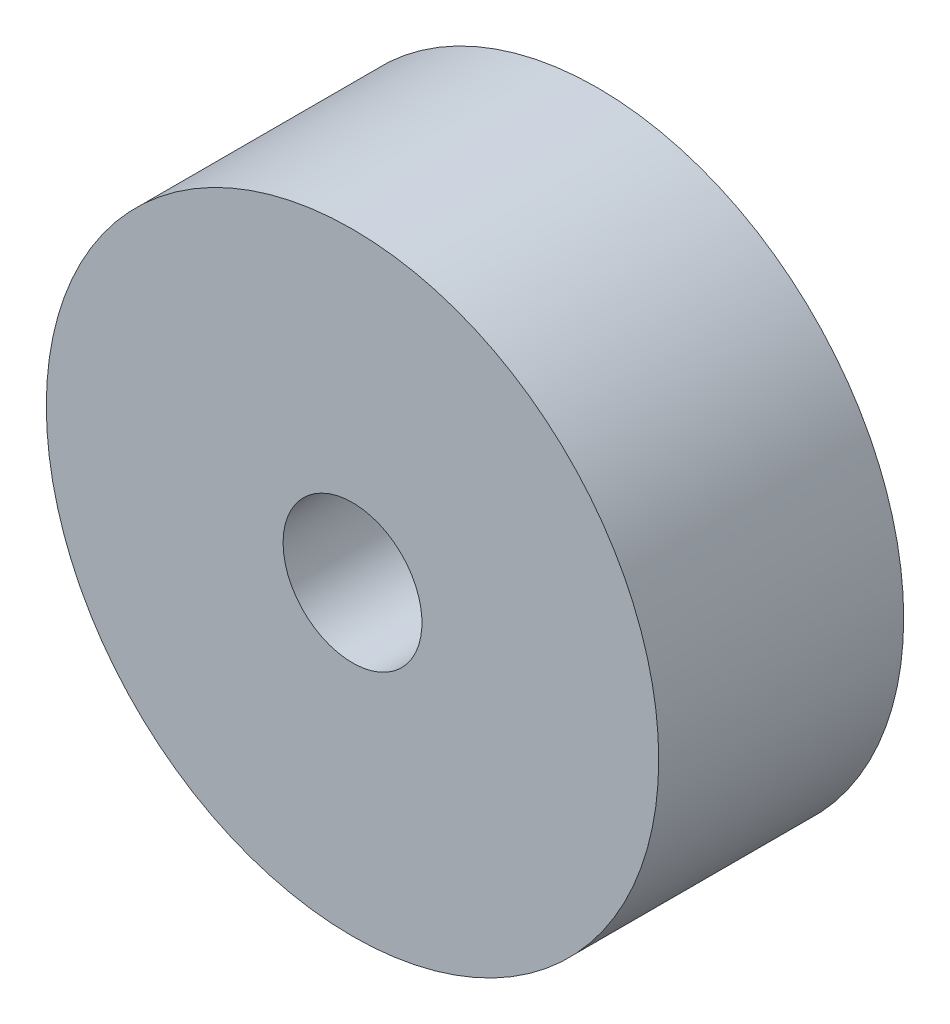
ISO-10303-21;
HEADER;
FILE_DESCRIPTION(('STEP AP214'),'2;1');
FILE_NAME('part.step','',(''),(''),'','','');
FILE_SCHEMA(('AUTOMOTIVE_DESIGN { 1 0 10303 214 1 1 1 1 }'));
ENDSEC;
DATA;
#1=APPLICATION_CONTEXT('core data for automotive mechanical design processes');
#2=APPLICATION_PROTOCOL_DEFINITION('international standard','automotive_design',2000,#1);
#3=PRODUCT_CONTEXT('',#1,'mechanical');
#4=PRODUCT('Part','Part','',(#3));
#5=PRODUCT_RELATED_PRODUCT_CATEGORY('part','',(#4));
#6=PRODUCT_DEFINITION_FORMATION('','',#4);
#7=PRODUCT_DEFINITION_CONTEXT('part definition',#1,'design');
#8=PRODUCT_DEFINITION('design','',#6,#7);
#9=PRODUCT_DEFINITION_SHAPE('','',#8);
#10=(LENGTH_UNIT() NAMED_UNIT(*) SI_UNIT(.MILLI.,.METRE.));
#11=(NAMED_UNIT(*) PLANE_ANGLE_UNIT() SI_UNIT($,.RADIAN.));
#12=(NAMED_UNIT(*) SI_UNIT($,.STERADIAN.) SOLID_ANGLE_UNIT());
#13=UNCERTAINTY_MEASURE_WITH_UNIT(LENGTH_MEASURE(1.E-05),#10,'distance_accuracy_value','');
#14=(GEOMETRIC_REPRESENTATION_CONTEXT(3) GLOBAL_UNCERTAINTY_ASSIGNED_CONTEXT((#13)) GLOBAL_UNIT_ASSIGNED_CONTEXT((#10,
#11,#12)) REPRESENTATION_CONTEXT('',''));
#15=CARTESIAN_POINT('',(0.,0.,0.));
#16=DIRECTION('',(0.,0.,1.));
#17=DIRECTION('',(1.,0.,0.));
#18=AXIS2_PLACEMENT_3D('',#15,#16,#17);
#19=CARTESIAN_POINT('',(3.5,0.,2.8));
#20=DIRECTION('',(0.,0.,1.));
#21=DIRECTION('',(1.,0.,0.));
#22=AXIS2_PLACEMENT_3D('',#19,#20,#21);
#23=PLANE('',#22);
#24=CARTESIAN_POINT('',(0.,0.,2.8));
#25=DIRECTION('',(0.,0.,-1.));
#26=DIRECTION('',(-1.,0.,0.));
#27=AXIS2_PLACEMENT_3D('',#24,#25,#26);
#28=CIRCLE('',#27,0.79375);
#29=CARTESIAN_POINT('',(-0.79375,0.,2.8));
#30=VERTEX_POINT('',#29);
#31=EDGE_CURVE('E10',#30,#30,#28,.T.);
#32=ORIENTED_EDGE('',*,*,#31,.T.);
#33=EDGE_LOOP('',(#32));
#34=FACE_BOUND('',#33,.T.);
#35=CARTESIAN_POINT('',(0.,0.,2.8));
#36=DIRECTION('',(0.,0.,-1.));
#37=DIRECTION('',(-1.,0.,0.));
#38=AXIS2_PLACEMENT_3D('',#35,#36,#37);
#39=CIRCLE('',#38,3.5);
#40=CARTESIAN_POINT('',(-3.5,0.,2.8));
#41=VERTEX_POINT('',#40);
#42=EDGE_CURVE('E45',#41,#41,#39,.T.);
#43=ORIENTED_EDGE('',*,*,#42,.F.);
#44=EDGE_LOOP('',(#43));
#45=FACE_BOUND('',#44,.T.);
#46=ADVANCED_FACE('F31',(#34,#45),#23,.T.);
#47=CARTESIAN_POINT('',(0.,0.,2.8));
#48=DIRECTION('',(0.,0.,-1.));
#49=DIRECTION('',(-1.,0.,0.));
#50=AXIS2_PLACEMENT_3D('',#47,#48,#49);
#51=CYLINDRICAL_SURFACE('',#50,0.79375);
#52=CARTESIAN_POINT('',(0.,0.,0.));
#53=DIRECTION('',(0.,0.,-1.));
#54=DIRECTION('',(-1.,0.,0.));
#55=AXIS2_PLACEMENT_3D('',#52,#53,#54);
#56=CIRCLE('',#55,0.79375);
#57=CARTESIAN_POINT('',(-0.79375,0.,0.));
#58=VERTEX_POINT('',#57);
#59=EDGE_CURVE('E37',#58,#58,#56,.T.);
#60=ORIENTED_EDGE('',*,*,#59,.T.);
#61=EDGE_LOOP('',(#60));
#62=FACE_BOUND('',#61,.T.);
#63=ORIENTED_EDGE('',*,*,#31,.F.);
#64=EDGE_LOOP('',(#63));
#65=FACE_BOUND('',#64,.T.);
#66=ADVANCED_FACE('F55',(#62,#65),#51,.F.);
#67=CARTESIAN_POINT('',(0.79375,0.,0.));
#68=DIRECTION('',(0.,0.,-1.));
#69=DIRECTION('',(-1.,0.,0.));
#70=AXIS2_PLACEMENT_3D('',#67,#68,#69);
#71=PLANE('',#70);
#72=CARTESIAN_POINT('',(0.,0.,0.));
#73=DIRECTION('',(0.,0.,-1.));
#74=DIRECTION('',(-1.,0.,0.));
#75=AXIS2_PLACEMENT_3D('',#72,#73,#74);
#76=CIRCLE('',#75,3.5);
#77=CARTESIAN_POINT('',(-3.5,0.,0.));
#78=VERTEX_POINT('',#77);
#79=EDGE_CURVE('E41',#78,#78,#76,.T.);
#80=ORIENTED_EDGE('',*,*,#79,.T.);
#81=EDGE_LOOP('',(#80));
#82=FACE_BOUND('',#81,.T.);
#83=ORIENTED_EDGE('',*,*,#59,.F.);
#84=EDGE_LOOP('',(#83));
#85=FACE_BOUND('',#84,.T.);
#86=ADVANCED_FACE('F59',(#82,#85),#71,.T.);
#87=CARTESIAN_POINT('',(0.,0.,2.8));
#88=DIRECTION('',(0.,0.,-1.));
#89=DIRECTION('',(-1.,0.,0.));
#90=AXIS2_PLACEMENT_3D('',#87,#88,#89);
#91=CYLINDRICAL_SURFACE('',#90,3.5);
#92=ORIENTED_EDGE('',*,*,#42,.T.);
#93=EDGE_LOOP('',(#92));
#94=FACE_BOUND('',#93,.T.);
#95=ORIENTED_EDGE('',*,*,#79,.F.);
#96=EDGE_LOOP('',(#95));
#97=FACE_BOUND('',#96,.T.);
#98=ADVANCED_FACE('F51',(#94,#97),#91,.T.);
#99=CLOSED_SHELL('',(#46,#66,#86,#98));
#100=MANIFOLD_SOLID_BREP('B2',#99);
#101=ADVANCED_BREP_SHAPE_REPRESENTATION('',(#18,#100),#14);
#102=SHAPE_DEFINITION_REPRESENTATION(#9,#101);
ENDSEC;
END-ISO-10303-21;
